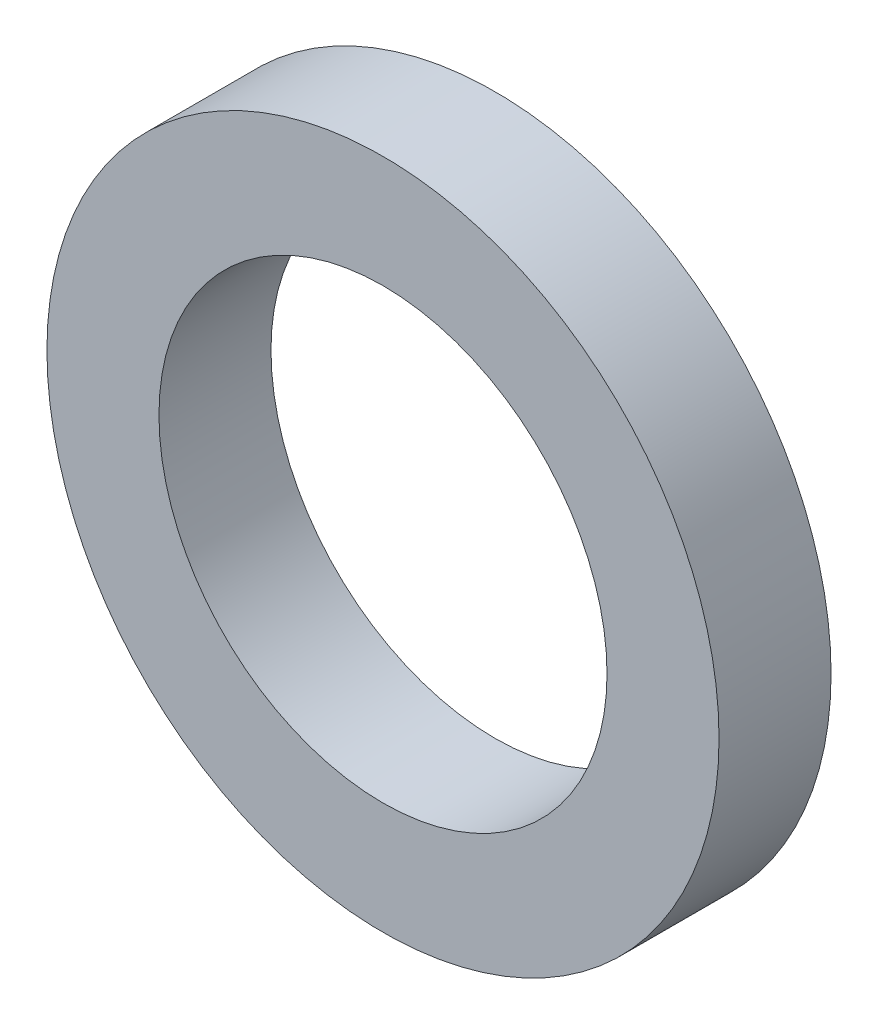
ISO-10303-21;
HEADER;
FILE_DESCRIPTION(('STEP AP214'),'2;1');
FILE_NAME('part.step','',(''),(''),'','','');
FILE_SCHEMA(('AUTOMOTIVE_DESIGN { 1 0 10303 214 1 1 1 1 }'));
ENDSEC;
DATA;
#1=APPLICATION_CONTEXT('core data for automotive mechanical design processes');
#2=APPLICATION_PROTOCOL_DEFINITION('international standard','automotive_design',2000,#1);
#3=PRODUCT_CONTEXT('',#1,'mechanical');
#4=PRODUCT('Part','Part','',(#3));
#5=PRODUCT_RELATED_PRODUCT_CATEGORY('part','',(#4));
#6=PRODUCT_DEFINITION_FORMATION('','',#4);
#7=PRODUCT_DEFINITION_CONTEXT('part definition',#1,'design');
#8=PRODUCT_DEFINITION('design','',#6,#7);
#9=PRODUCT_DEFINITION_SHAPE('','',#8);
#10=(LENGTH_UNIT() NAMED_UNIT(*) SI_UNIT(.MILLI.,.METRE.));
#11=(NAMED_UNIT(*) PLANE_ANGLE_UNIT() SI_UNIT($,.RADIAN.));
#12=(NAMED_UNIT(*) SI_UNIT($,.STERADIAN.) SOLID_ANGLE_UNIT());
#13=UNCERTAINTY_MEASURE_WITH_UNIT(LENGTH_MEASURE(1.E-05),#10,'distance_accuracy_value','');
#14=(GEOMETRIC_REPRESENTATION_CONTEXT(3) GLOBAL_UNCERTAINTY_ASSIGNED_CONTEXT((#13)) GLOBAL_UNIT_ASSIGNED_CONTEXT((#10,
#11,#12)) REPRESENTATION_CONTEXT('',''));
#15=CARTESIAN_POINT('',(0.,0.,0.));
#16=DIRECTION('',(0.,0.,1.));
#17=DIRECTION('',(1.,0.,0.));
#18=AXIS2_PLACEMENT_3D('',#15,#16,#17);
#19=CARTESIAN_POINT('',(0.,0.,1.));
#20=DIRECTION('',(0.,0.,1.));
#21=DIRECTION('',(1.,0.,0.));
#22=AXIS2_PLACEMENT_3D('',#19,#20,#21);
#23=PLANE('',#22);
#24=CARTESIAN_POINT('',(0.,0.,1.));
#25=DIRECTION('',(0.,0.,1.));
#26=DIRECTION('',(1.,0.,0.));
#27=AXIS2_PLACEMENT_3D('',#24,#25,#26);
#28=CIRCLE('',#27,3.);
#29=CARTESIAN_POINT('',(3.,0.,1.));
#30=VERTEX_POINT('',#29);
#31=EDGE_CURVE('E11',#30,#30,#28,.T.);
#32=ORIENTED_EDGE('',*,*,#31,.T.);
#33=EDGE_LOOP('',(#32));
#34=FACE_BOUND('',#33,.T.);
#35=CARTESIAN_POINT('',(0.,0.,1.));
#36=DIRECTION('',(0.,0.,1.));
#37=DIRECTION('',(1.,0.,0.));
#38=AXIS2_PLACEMENT_3D('',#35,#36,#37);
#39=CIRCLE('',#38,2.);
#40=CARTESIAN_POINT('',(2.,0.,1.));
#41=VERTEX_POINT('',#40);
#42=EDGE_CURVE('E54',#41,#41,#39,.T.);
#43=ORIENTED_EDGE('',*,*,#42,.F.);
#44=EDGE_LOOP('',(#43));
#45=FACE_BOUND('',#44,.T.);
#46=ADVANCED_FACE('F43',(#34,#45),#23,.T.);
#47=CARTESIAN_POINT('',(0.,0.,0.));
#48=DIRECTION('',(0.,0.,1.));
#49=DIRECTION('',(1.,0.,0.));
#50=AXIS2_PLACEMENT_3D('',#47,#48,#49);
#51=PLANE('',#50);
#52=CARTESIAN_POINT('',(0.,0.,0.));
#53=DIRECTION('',(0.,0.,1.));
#54=DIRECTION('',(1.,0.,0.));
#55=AXIS2_PLACEMENT_3D('',#52,#53,#54);
#56=CIRCLE('',#55,3.);
#57=CARTESIAN_POINT('',(3.,0.,0.));
#58=VERTEX_POINT('',#57);
#59=EDGE_CURVE('E47',#58,#58,#56,.T.);
#60=ORIENTED_EDGE('',*,*,#59,.F.);
#61=EDGE_LOOP('',(#60));
#62=FACE_BOUND('',#61,.T.);
#63=CARTESIAN_POINT('',(0.,0.,0.));
#64=DIRECTION('',(0.,0.,1.));
#65=DIRECTION('',(1.,0.,0.));
#66=AXIS2_PLACEMENT_3D('',#63,#64,#65);
#67=CIRCLE('',#66,2.);
#68=CARTESIAN_POINT('',(2.,0.,0.));
#69=VERTEX_POINT('',#68);
#70=EDGE_CURVE('E56',#69,#69,#67,.T.);
#71=ORIENTED_EDGE('',*,*,#70,.T.);
#72=EDGE_LOOP('',(#71));
#73=FACE_BOUND('',#72,.T.);
#74=ADVANCED_FACE('F66',(#62,#73),#51,.F.);
#75=CARTESIAN_POINT('',(0.,0.,1.));
#76=DIRECTION('',(0.,0.,-1.));
#77=DIRECTION('',(-1.,0.,0.));
#78=AXIS2_PLACEMENT_3D('',#75,#76,#77);
#79=CYLINDRICAL_SURFACE('',#78,3.);
#80=ORIENTED_EDGE('',*,*,#31,.F.);
#81=EDGE_LOOP('',(#80));
#82=FACE_BOUND('',#81,.T.);
#83=ORIENTED_EDGE('',*,*,#59,.T.);
#84=EDGE_LOOP('',(#83));
#85=FACE_BOUND('',#84,.T.);
#86=ADVANCED_FACE('F45',(#82,#85),#79,.T.);
#87=CARTESIAN_POINT('',(0.,0.,1.));
#88=DIRECTION('',(0.,0.,-1.));
#89=DIRECTION('',(-1.,0.,0.));
#90=AXIS2_PLACEMENT_3D('',#87,#88,#89);
#91=CYLINDRICAL_SURFACE('',#90,2.);
#92=ORIENTED_EDGE('',*,*,#42,.T.);
#93=EDGE_LOOP('',(#92));
#94=FACE_BOUND('',#93,.T.);
#95=ORIENTED_EDGE('',*,*,#70,.F.);
#96=EDGE_LOOP('',(#95));
#97=FACE_BOUND('',#96,.T.);
#98=ADVANCED_FACE('F62',(#94,#97),#91,.F.);
#99=CLOSED_SHELL('',(#46,#74,#86,#98));
#100=MANIFOLD_SOLID_BREP('B2',#99);
#101=ADVANCED_BREP_SHAPE_REPRESENTATION('',(#18,#100),#14);
#102=SHAPE_DEFINITION_REPRESENTATION(#9,#101);
ENDSEC;
END-ISO-10303-21;
